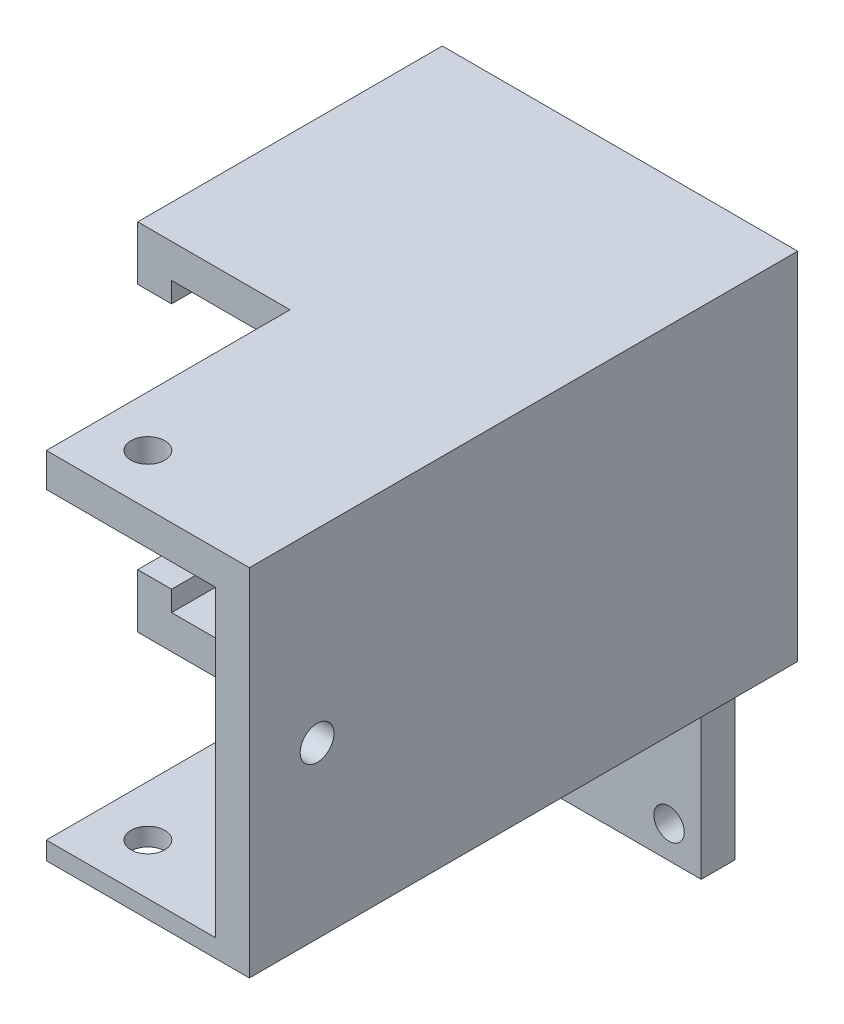
ISO-10303-21;
HEADER;
FILE_DESCRIPTION(('STEP AP214'),'2;1');
FILE_NAME('part.step','',(''),(''),'','','');
FILE_SCHEMA(('AUTOMOTIVE_DESIGN { 1 0 10303 214 1 1 1 1 }'));
ENDSEC;
DATA;
#1=APPLICATION_CONTEXT('core data for automotive mechanical design processes');
#2=APPLICATION_PROTOCOL_DEFINITION('international standard','automotive_design',2000,#1);
#3=PRODUCT_CONTEXT('',#1,'mechanical');
#4=PRODUCT('Part','Part','',(#3));
#5=PRODUCT_RELATED_PRODUCT_CATEGORY('part','',(#4));
#6=PRODUCT_DEFINITION_FORMATION('','',#4);
#7=PRODUCT_DEFINITION_CONTEXT('part definition',#1,'design');
#8=PRODUCT_DEFINITION('design','',#6,#7);
#9=PRODUCT_DEFINITION_SHAPE('','',#8);
#10=(LENGTH_UNIT() NAMED_UNIT(*) SI_UNIT(.MILLI.,.METRE.));
#11=(NAMED_UNIT(*) PLANE_ANGLE_UNIT() SI_UNIT($,.RADIAN.));
#12=(NAMED_UNIT(*) SI_UNIT($,.STERADIAN.) SOLID_ANGLE_UNIT());
#13=UNCERTAINTY_MEASURE_WITH_UNIT(LENGTH_MEASURE(1.E-05),#10,'distance_accuracy_value','');
#14=(GEOMETRIC_REPRESENTATION_CONTEXT(3) GLOBAL_UNCERTAINTY_ASSIGNED_CONTEXT((#13)) GLOBAL_UNIT_ASSIGNED_CONTEXT((#10,
#11,#12)) REPRESENTATION_CONTEXT('',''));
#15=CARTESIAN_POINT('',(0.,0.,0.));
#16=DIRECTION('',(0.,0.,1.));
#17=DIRECTION('',(1.,0.,0.));
#18=AXIS2_PLACEMENT_3D('',#15,#16,#17);
#19=CARTESIAN_POINT('',(0.,0.,45.));
#20=DIRECTION('',(0.,0.,1.));
#21=DIRECTION('',(1.,0.,0.));
#22=AXIS2_PLACEMENT_3D('',#19,#20,#21);
#23=PLANE('',#22);
#24=DIRECTION('',(-1.,0.,0.));
#25=VECTOR('',#24,1.);
#26=CARTESIAN_POINT('',(14.75,38.,45.));
#27=LINE('',#26,#25);
#28=CARTESIAN_POINT('',(-4.24999999999998,38.,45.));
#29=VERTEX_POINT('',#28);
#30=CARTESIAN_POINT('',(-9.24999999999999,38.,45.));
#31=VERTEX_POINT('',#30);
#32=EDGE_CURVE('E231',#29,#31,#27,.T.);
#33=ORIENTED_EDGE('',*,*,#32,.T.);
#34=DIRECTION('',(0.,-1.,0.));
#35=VECTOR('',#34,1.);
#36=CARTESIAN_POINT('',(-9.24999999999999,82.5,45.));
#37=LINE('',#36,#35);
#38=CARTESIAN_POINT('',(-9.24999999999999,30.,45.));
#39=VERTEX_POINT('',#38);
#40=EDGE_CURVE('E314',#31,#39,#37,.T.);
#41=ORIENTED_EDGE('',*,*,#40,.T.);
#42=DIRECTION('',(1.,0.,0.));
#43=VECTOR('',#42,1.);
#44=CARTESIAN_POINT('',(-9.24999999999999,30.,45.));
#45=LINE('',#44,#43);
#46=CARTESIAN_POINT('',(13.25,30.,45.));
#47=VERTEX_POINT('',#46);
#48=EDGE_CURVE('E318',#39,#47,#45,.T.);
#49=ORIENTED_EDGE('',*,*,#48,.T.);
#50=DIRECTION('',(0.,-1.,0.));
#51=VECTOR('',#50,1.);
#52=CARTESIAN_POINT('',(13.25,30.,45.));
#53=LINE('',#52,#51);
#54=CARTESIAN_POINT('',(13.25,35.,45.));
#55=VERTEX_POINT('',#54);
#56=EDGE_CURVE('E258',#55,#47,#53,.T.);
#57=ORIENTED_EDGE('',*,*,#56,.F.);
#58=DIRECTION('',(1.,0.,0.));
#59=VECTOR('',#58,1.);
#60=CARTESIAN_POINT('',(-4.24999999999998,35.,45.));
#61=LINE('',#60,#59);
#62=CARTESIAN_POINT('',(-4.24999999999998,35.,45.));
#63=VERTEX_POINT('',#62);
#64=EDGE_CURVE('E287',#63,#55,#61,.T.);
#65=ORIENTED_EDGE('',*,*,#64,.F.);
#66=DIRECTION('',(0.,-1.,0.));
#67=VECTOR('',#66,1.);
#68=CARTESIAN_POINT('',(-4.24999999999999,77.5,45.));
#69=LINE('',#68,#67);
#70=EDGE_CURVE('E288',#29,#63,#69,.T.);
#71=ORIENTED_EDGE('',*,*,#70,.F.);
#72=EDGE_LOOP('',(#33,#41,#49,#57,#65,#71));
#73=FACE_BOUND('',#72,.T.);
#74=ADVANCED_FACE('F39',(#73),#23,.T.);
#75=CARTESIAN_POINT('',(-4.24999999999999,77.5,45.));
#76=DIRECTION('',(1.,0.,0.));
#77=DIRECTION('',(0.,1.,0.));
#78=AXIS2_PLACEMENT_3D('',#75,#76,#77);
#79=PLANE('',#78);
#80=DIRECTION('',(0.,0.,-1.));
#81=VECTOR('',#80,1.);
#82=CARTESIAN_POINT('',(-4.24999999999998,38.,45.));
#83=LINE('',#82,#81);
#84=CARTESIAN_POINT('',(-4.24999999999999,38.,5.));
#85=VERTEX_POINT('',#84);
#86=EDGE_CURVE('E240',#29,#85,#83,.T.);
#87=ORIENTED_EDGE('',*,*,#86,.F.);
#88=ORIENTED_EDGE('',*,*,#70,.T.);
#89=DIRECTION('',(0.,0.,-1.));
#90=VECTOR('',#89,1.);
#91=CARTESIAN_POINT('',(-4.24999999999998,35.,45.));
#92=LINE('',#91,#90);
#93=CARTESIAN_POINT('',(-4.24999999999998,35.,5.));
#94=VERTEX_POINT('',#93);
#95=EDGE_CURVE('E311',#63,#94,#92,.T.);
#96=ORIENTED_EDGE('',*,*,#95,.T.);
#97=DIRECTION('',(0.,-1.,0.));
#98=VECTOR('',#97,1.);
#99=CARTESIAN_POINT('',(-4.24999999999999,77.5,5.));
#100=LINE('',#99,#98);
#101=EDGE_CURVE('E283',#85,#94,#100,.T.);
#102=ORIENTED_EDGE('',*,*,#101,.F.);
#103=EDGE_LOOP('',(#87,#88,#96,#102));
#104=FACE_BOUND('',#103,.T.);
#105=ADVANCED_FACE('F415',(#104),#79,.T.);
#106=CARTESIAN_POINT('',(0.,0.,5.));
#107=DIRECTION('',(0.,0.,1.));
#108=DIRECTION('',(1.,0.,0.));
#109=AXIS2_PLACEMENT_3D('',#106,#107,#108);
#110=PLANE('',#109);
#111=DIRECTION('',(1.,0.,0.));
#112=VECTOR('',#111,1.);
#113=CARTESIAN_POINT('',(-9.24999999999999,30.,5.));
#114=LINE('',#113,#112);
#115=CARTESIAN_POINT('',(0.,30.,5.));
#116=VERTEX_POINT('',#115);
#117=CARTESIAN_POINT('',(34.,30.,5.));
#118=VERTEX_POINT('',#117);
#119=EDGE_CURVE('E11',#116,#118,#114,.T.);
#120=ORIENTED_EDGE('',*,*,#119,.F.);
#121=DIRECTION('',(0.,-1.,0.));
#122=VECTOR('',#121,1.);
#123=CARTESIAN_POINT('',(0.,0.,5.));
#124=LINE('',#123,#122);
#125=CARTESIAN_POINT('',(0.,0.,5.));
#126=VERTEX_POINT('',#125);
#127=EDGE_CURVE('E347',#116,#126,#124,.T.);
#128=ORIENTED_EDGE('',*,*,#127,.T.);
#129=DIRECTION('',(1.,0.,0.));
#130=VECTOR('',#129,1.);
#131=CARTESIAN_POINT('',(0.,0.,5.));
#132=LINE('',#131,#130);
#133=CARTESIAN_POINT('',(34.,0.,5.));
#134=VERTEX_POINT('',#133);
#135=EDGE_CURVE('E350',#126,#134,#132,.T.);
#136=ORIENTED_EDGE('',*,*,#135,.T.);
#137=DIRECTION('',(0.,1.,0.));
#138=VECTOR('',#137,1.);
#139=CARTESIAN_POINT('',(34.,0.,5.));
#140=LINE('',#139,#138);
#141=EDGE_CURVE('E353',#134,#118,#140,.T.);
#142=ORIENTED_EDGE('',*,*,#141,.T.);
#143=EDGE_LOOP('',(#120,#128,#136,#142));
#144=FACE_BOUND('',#143,.T.);
#145=CARTESIAN_POINT('',(29.25,4.75,5.));
#146=DIRECTION('',(0.,0.,1.));
#147=DIRECTION('',(1.,0.,0.));
#148=AXIS2_PLACEMENT_3D('',#145,#146,#147);
#149=CIRCLE('',#148,2.25);
#150=CARTESIAN_POINT('',(31.5,4.75,5.));
#151=VERTEX_POINT('',#150);
#152=EDGE_CURVE('E329',#151,#151,#149,.T.);
#153=ORIENTED_EDGE('',*,*,#152,.F.);
#154=EDGE_LOOP('',(#153));
#155=FACE_BOUND('',#154,.T.);
#156=CARTESIAN_POINT('',(4.75,25.25,5.));
#157=DIRECTION('',(0.,0.,1.));
#158=DIRECTION('',(1.,0.,0.));
#159=AXIS2_PLACEMENT_3D('',#156,#157,#158);
#160=CIRCLE('',#159,2.25);
#161=CARTESIAN_POINT('',(7.,25.25,5.));
#162=VERTEX_POINT('',#161);
#163=EDGE_CURVE('E341',#162,#162,#160,.T.);
#164=ORIENTED_EDGE('',*,*,#163,.F.);
#165=EDGE_LOOP('',(#164));
#166=FACE_BOUND('',#165,.T.);
#167=CARTESIAN_POINT('',(29.25,25.25,5.));
#168=DIRECTION('',(0.,0.,1.));
#169=DIRECTION('',(1.,0.,0.));
#170=AXIS2_PLACEMENT_3D('',#167,#168,#169);
#171=CIRCLE('',#170,2.25000000000001);
#172=CARTESIAN_POINT('',(31.5,25.25,5.));
#173=VERTEX_POINT('',#172);
#174=EDGE_CURVE('E335',#173,#173,#171,.T.);
#175=ORIENTED_EDGE('',*,*,#174,.F.);
#176=EDGE_LOOP('',(#175));
#177=FACE_BOUND('',#176,.T.);
#178=CARTESIAN_POINT('',(4.75,4.75,5.));
#179=DIRECTION('',(0.,0.,1.));
#180=DIRECTION('',(1.,0.,0.));
#181=AXIS2_PLACEMENT_3D('',#178,#179,#180);
#182=CIRCLE('',#181,2.25);
#183=CARTESIAN_POINT('',(7.,4.75,5.));
#184=VERTEX_POINT('',#183);
#185=EDGE_CURVE('E323',#184,#184,#182,.T.);
#186=ORIENTED_EDGE('',*,*,#185,.F.);
#187=EDGE_LOOP('',(#186));
#188=FACE_BOUND('',#187,.T.);
#189=ADVANCED_FACE('F422',(#144,#155,#166,#177,#188),#110,.T.);
#190=CARTESIAN_POINT('',(0.,0.,0.));
#191=DIRECTION('',(0.,0.,1.));
#192=DIRECTION('',(1.,0.,0.));
#193=AXIS2_PLACEMENT_3D('',#190,#191,#192);
#194=PLANE('',#193);
#195=DIRECTION('',(0.,-1.,0.));
#196=VECTOR('',#195,1.);
#197=CARTESIAN_POINT('',(0.,0.,0.));
#198=LINE('',#197,#196);
#199=CARTESIAN_POINT('',(0.,30.,0.));
#200=VERTEX_POINT('',#199);
#201=CARTESIAN_POINT('',(0.,0.,0.));
#202=VERTEX_POINT('',#201);
#203=EDGE_CURVE('E344',#200,#202,#198,.T.);
#204=ORIENTED_EDGE('',*,*,#203,.F.);
#205=DIRECTION('',(1.,0.,0.));
#206=VECTOR('',#205,1.);
#207=CARTESIAN_POINT('',(0.,30.,0.));
#208=LINE('',#207,#206);
#209=CARTESIAN_POINT('',(-9.24999999999999,30.,0.));
#210=VERTEX_POINT('',#209);
#211=EDGE_CURVE('E351',#210,#200,#208,.T.);
#212=ORIENTED_EDGE('',*,*,#211,.F.);
#213=DIRECTION('',(0.,-1.,0.));
#214=VECTOR('',#213,1.);
#215=CARTESIAN_POINT('',(-9.24999999999999,30.,0.));
#216=LINE('',#215,#214);
#217=CARTESIAN_POINT('',(-9.24999999999999,82.5,0.));
#218=VERTEX_POINT('',#217);
#219=EDGE_CURVE('E368',#218,#210,#216,.T.);
#220=ORIENTED_EDGE('',*,*,#219,.F.);
#221=DIRECTION('',(-1.,0.,0.));
#222=VECTOR('',#221,1.);
#223=CARTESIAN_POINT('',(-9.24999999999999,82.5,0.));
#224=LINE('',#223,#222);
#225=CARTESIAN_POINT('',(43.25,82.5,0.));
#226=VERTEX_POINT('',#225);
#227=EDGE_CURVE('E366',#226,#218,#224,.T.);
#228=ORIENTED_EDGE('',*,*,#227,.F.);
#229=DIRECTION('',(0.,1.,0.));
#230=VECTOR('',#229,1.);
#231=CARTESIAN_POINT('',(43.25,82.5,0.));
#232=LINE('',#231,#230);
#233=CARTESIAN_POINT('',(43.25,30.,0.));
#234=VERTEX_POINT('',#233);
#235=EDGE_CURVE('E364',#234,#226,#232,.T.);
#236=ORIENTED_EDGE('',*,*,#235,.F.);
#237=DIRECTION('',(1.,0.,0.));
#238=VECTOR('',#237,1.);
#239=CARTESIAN_POINT('',(34.,30.,0.));
#240=LINE('',#239,#238);
#241=CARTESIAN_POINT('',(34.,30.,0.));
#242=VERTEX_POINT('',#241);
#243=EDGE_CURVE('E362',#242,#234,#240,.T.);
#244=ORIENTED_EDGE('',*,*,#243,.F.);
#245=DIRECTION('',(0.,1.,0.));
#246=VECTOR('',#245,1.);
#247=CARTESIAN_POINT('',(34.,0.,0.));
#248=LINE('',#247,#246);
#249=CARTESIAN_POINT('',(34.,0.,0.));
#250=VERTEX_POINT('',#249);
#251=EDGE_CURVE('E360',#250,#242,#248,.T.);
#252=ORIENTED_EDGE('',*,*,#251,.F.);
#253=DIRECTION('',(1.,0.,0.));
#254=VECTOR('',#253,1.);
#255=CARTESIAN_POINT('',(0.,0.,0.));
#256=LINE('',#255,#254);
#257=EDGE_CURVE('E358',#202,#250,#256,.T.);
#258=ORIENTED_EDGE('',*,*,#257,.F.);
#259=EDGE_LOOP('',(#204,#212,#220,#228,#236,#244,#252,#258));
#260=FACE_BOUND('',#259,.T.);
#261=CARTESIAN_POINT('',(4.75,25.25,0.));
#262=DIRECTION('',(0.,0.,1.));
#263=DIRECTION('',(1.,0.,0.));
#264=AXIS2_PLACEMENT_3D('',#261,#262,#263);
#265=CIRCLE('',#264,2.25);
#266=CARTESIAN_POINT('',(7.,25.25,0.));
#267=VERTEX_POINT('',#266);
#268=EDGE_CURVE('E338',#267,#267,#265,.T.);
#269=ORIENTED_EDGE('',*,*,#268,.T.);
#270=EDGE_LOOP('',(#269));
#271=FACE_BOUND('',#270,.T.);
#272=CARTESIAN_POINT('',(29.25,25.25,0.));
#273=DIRECTION('',(0.,0.,1.));
#274=DIRECTION('',(1.,0.,0.));
#275=AXIS2_PLACEMENT_3D('',#272,#273,#274);
#276=CIRCLE('',#275,2.25000000000001);
#277=CARTESIAN_POINT('',(31.5,25.25,0.));
#278=VERTEX_POINT('',#277);
#279=EDGE_CURVE('E332',#278,#278,#276,.T.);
#280=ORIENTED_EDGE('',*,*,#279,.T.);
#281=EDGE_LOOP('',(#280));
#282=FACE_BOUND('',#281,.T.);
#283=CARTESIAN_POINT('',(29.25,4.75,0.));
#284=DIRECTION('',(0.,0.,1.));
#285=DIRECTION('',(1.,0.,0.));
#286=AXIS2_PLACEMENT_3D('',#283,#284,#285);
#287=CIRCLE('',#286,2.25);
#288=CARTESIAN_POINT('',(31.5,4.75,0.));
#289=VERTEX_POINT('',#288);
#290=EDGE_CURVE('E326',#289,#289,#287,.T.);
#291=ORIENTED_EDGE('',*,*,#290,.T.);
#292=EDGE_LOOP('',(#291));
#293=FACE_BOUND('',#292,.T.);
#294=CARTESIAN_POINT('',(4.75,4.75,0.));
#295=DIRECTION('',(0.,0.,1.));
#296=DIRECTION('',(1.,0.,0.));
#297=AXIS2_PLACEMENT_3D('',#294,#295,#296);
#298=CIRCLE('',#297,2.25);
#299=CARTESIAN_POINT('',(7.,4.75,0.));
#300=VERTEX_POINT('',#299);
#301=EDGE_CURVE('E321',#300,#300,#298,.T.);
#302=ORIENTED_EDGE('',*,*,#301,.T.);
#303=EDGE_LOOP('',(#302));
#304=FACE_BOUND('',#303,.T.);
#305=ADVANCED_FACE('F498',(#260,#271,#282,#293,#304),#194,.F.);
#306=CARTESIAN_POINT('',(0.,0.,5.));
#307=DIRECTION('',(1.,0.,0.));
#308=DIRECTION('',(0.,1.,0.));
#309=AXIS2_PLACEMENT_3D('',#306,#307,#308);
#310=PLANE('',#309);
#311=ORIENTED_EDGE('',*,*,#203,.T.);
#312=DIRECTION('',(0.,0.,-1.));
#313=VECTOR('',#312,1.);
#314=CARTESIAN_POINT('',(0.,0.,5.));
#315=LINE('',#314,#313);
#316=EDGE_CURVE('E48',#126,#202,#315,.T.);
#317=ORIENTED_EDGE('',*,*,#316,.F.);
#318=ORIENTED_EDGE('',*,*,#127,.F.);
#319=DIRECTION('',(0.,0.,-1.));
#320=VECTOR('',#319,1.);
#321=CARTESIAN_POINT('',(0.,30.,5.));
#322=LINE('',#321,#320);
#323=EDGE_CURVE('E355',#116,#200,#322,.T.);
#324=ORIENTED_EDGE('',*,*,#323,.T.);
#325=EDGE_LOOP('',(#311,#317,#318,#324));
#326=FACE_BOUND('',#325,.T.);
#327=ADVANCED_FACE('F41',(#326),#310,.F.);
#328=CARTESIAN_POINT('',(0.,0.,5.));
#329=DIRECTION('',(0.,1.,0.));
#330=DIRECTION('',(0.,0.,1.));
#331=AXIS2_PLACEMENT_3D('',#328,#329,#330);
#332=PLANE('',#331);
#333=ORIENTED_EDGE('',*,*,#257,.T.);
#334=DIRECTION('',(0.,0.,-1.));
#335=VECTOR('',#334,1.);
#336=CARTESIAN_POINT('',(34.,0.,5.));
#337=LINE('',#336,#335);
#338=EDGE_CURVE('E388',#134,#250,#337,.T.);
#339=ORIENTED_EDGE('',*,*,#338,.F.);
#340=ORIENTED_EDGE('',*,*,#135,.F.);
#341=ORIENTED_EDGE('',*,*,#316,.T.);
#342=EDGE_LOOP('',(#333,#339,#340,#341));
#343=FACE_BOUND('',#342,.T.);
#344=ADVANCED_FACE('F558',(#343),#332,.F.);
#345=CARTESIAN_POINT('',(34.,0.,5.));
#346=DIRECTION('',(-1.,0.,0.));
#347=DIRECTION('',(0.,-1.,0.));
#348=AXIS2_PLACEMENT_3D('',#345,#346,#347);
#349=PLANE('',#348);
#350=ORIENTED_EDGE('',*,*,#251,.T.);
#351=DIRECTION('',(0.,0.,-1.));
#352=VECTOR('',#351,1.);
#353=CARTESIAN_POINT('',(34.,30.,5.));
#354=LINE('',#353,#352);
#355=EDGE_CURVE('E385',#118,#242,#354,.T.);
#356=ORIENTED_EDGE('',*,*,#355,.F.);
#357=ORIENTED_EDGE('',*,*,#141,.F.);
#358=ORIENTED_EDGE('',*,*,#338,.T.);
#359=EDGE_LOOP('',(#350,#356,#357,#358));
#360=FACE_BOUND('',#359,.T.);
#361=ADVANCED_FACE('F555',(#360),#349,.F.);
#362=CARTESIAN_POINT('',(43.25,82.5,5.));
#363=DIRECTION('',(-1.,0.,0.));
#364=DIRECTION('',(0.,-1.,0.));
#365=AXIS2_PLACEMENT_3D('',#362,#363,#364);
#366=PLANE('',#365);
#367=CARTESIAN_POINT('',(43.25,55.075,71.));
#368=DIRECTION('',(1.,0.,0.));
#369=DIRECTION('',(0.,1.,0.));
#370=AXIS2_PLACEMENT_3D('',#367,#368,#369);
#371=CIRCLE('',#370,2.50000000000001);
#372=CARTESIAN_POINT('',(43.25,57.575,71.));
#373=VERTEX_POINT('',#372);
#374=EDGE_CURVE('E242',#373,#373,#371,.T.);
#375=ORIENTED_EDGE('',*,*,#374,.F.);
#376=EDGE_LOOP('',(#375));
#377=FACE_BOUND('',#376,.T.);
#378=ORIENTED_EDGE('',*,*,#235,.T.);
#379=DIRECTION('',(0.,0.,-1.));
#380=VECTOR('',#379,1.);
#381=CARTESIAN_POINT('',(43.25,82.5,5.));
#382=LINE('',#381,#380);
#383=CARTESIAN_POINT('',(43.25,82.5,81.));
#384=VERTEX_POINT('',#383);
#385=EDGE_CURVE('E379',#384,#226,#382,.T.);
#386=ORIENTED_EDGE('',*,*,#385,.F.);
#387=DIRECTION('',(0.,1.,0.));
#388=VECTOR('',#387,1.);
#389=CARTESIAN_POINT('',(43.25,82.5,81.));
#390=LINE('',#389,#388);
#391=CARTESIAN_POINT('',(43.25,30.,81.));
#392=VERTEX_POINT('',#391);
#393=EDGE_CURVE('E265',#392,#384,#390,.T.);
#394=ORIENTED_EDGE('',*,*,#393,.F.);
#395=DIRECTION('',(0.,0.,-1.));
#396=VECTOR('',#395,1.);
#397=CARTESIAN_POINT('',(43.25,30.,5.));
#398=LINE('',#397,#396);
#399=EDGE_CURVE('E382',#392,#234,#398,.T.);
#400=ORIENTED_EDGE('',*,*,#399,.T.);
#401=EDGE_LOOP('',(#378,#386,#394,#400));
#402=FACE_BOUND('',#401,.T.);
#403=ADVANCED_FACE('F551',(#377,#402),#366,.F.);
#404=CARTESIAN_POINT('',(-9.24999999999999,82.5,5.));
#405=DIRECTION('',(0.,-1.,0.));
#406=DIRECTION('',(0.,0.,-1.));
#407=AXIS2_PLACEMENT_3D('',#404,#405,#406);
#408=PLANE('',#407);
#409=CARTESIAN_POINT('',(20.75,82.5,73.5));
#410=DIRECTION('',(0.,-1.,0.));
#411=DIRECTION('',(0.,0.,-1.));
#412=AXIS2_PLACEMENT_3D('',#409,#410,#411);
#413=CIRCLE('',#412,2.5);
#414=CARTESIAN_POINT('',(20.75,82.5,71.));
#415=VERTEX_POINT('',#414);
#416=EDGE_CURVE('E246',#415,#415,#413,.T.);
#417=ORIENTED_EDGE('',*,*,#416,.T.);
#418=EDGE_LOOP('',(#417));
#419=FACE_BOUND('',#418,.T.);
#420=ORIENTED_EDGE('',*,*,#227,.T.);
#421=DIRECTION('',(0.,0.,-1.));
#422=VECTOR('',#421,1.);
#423=CARTESIAN_POINT('',(-9.24999999999999,82.5,5.));
#424=LINE('',#423,#422);
#425=CARTESIAN_POINT('',(-9.24999999999999,82.5,45.));
#426=VERTEX_POINT('',#425);
#427=EDGE_CURVE('E376',#426,#218,#424,.T.);
#428=ORIENTED_EDGE('',*,*,#427,.F.);
#429=DIRECTION('',(-1.,0.,0.));
#430=VECTOR('',#429,1.);
#431=CARTESIAN_POINT('',(-9.24999999999999,82.5,45.));
#432=LINE('',#431,#430);
#433=CARTESIAN_POINT('',(13.25,82.5,45.));
#434=VERTEX_POINT('',#433);
#435=EDGE_CURVE('E320',#434,#426,#432,.T.);
#436=ORIENTED_EDGE('',*,*,#435,.F.);
#437=DIRECTION('',(0.,0.,-1.));
#438=VECTOR('',#437,1.);
#439=CARTESIAN_POINT('',(13.25,82.5,81.));
#440=LINE('',#439,#438);
#441=CARTESIAN_POINT('',(13.25,82.5,81.));
#442=VERTEX_POINT('',#441);
#443=EDGE_CURVE('E280',#442,#434,#440,.T.);
#444=ORIENTED_EDGE('',*,*,#443,.F.);
#445=DIRECTION('',(-1.,0.,0.));
#446=VECTOR('',#445,1.);
#447=CARTESIAN_POINT('',(13.25,82.5,81.));
#448=LINE('',#447,#446);
#449=EDGE_CURVE('E254',#384,#442,#448,.T.);
#450=ORIENTED_EDGE('',*,*,#449,.F.);
#451=ORIENTED_EDGE('',*,*,#385,.T.);
#452=EDGE_LOOP('',(#420,#428,#436,#444,#450,#451));
#453=FACE_BOUND('',#452,.T.);
#454=ADVANCED_FACE('F451',(#419,#453),#408,.F.);
#455=CARTESIAN_POINT('',(-9.24999999999999,30.,5.));
#456=DIRECTION('',(1.,0.,0.));
#457=DIRECTION('',(0.,1.,0.));
#458=AXIS2_PLACEMENT_3D('',#455,#456,#457);
#459=PLANE('',#458);
#460=ORIENTED_EDGE('',*,*,#40,.F.);
#461=DIRECTION('',(0.,0.,1.));
#462=VECTOR('',#461,1.);
#463=CARTESIAN_POINT('',(-9.24999999999999,38.,45.));
#464=LINE('',#463,#462);
#465=CARTESIAN_POINT('',(-9.24999999999999,38.,5.));
#466=VERTEX_POINT('',#465);
#467=EDGE_CURVE('E228',#466,#31,#464,.T.);
#468=ORIENTED_EDGE('',*,*,#467,.F.);
#469=DIRECTION('',(0.,-1.,0.));
#470=VECTOR('',#469,1.);
#471=CARTESIAN_POINT('',(-9.24999999999999,74.5,5.));
#472=LINE('',#471,#470);
#473=CARTESIAN_POINT('',(-9.24999999999999,74.5,5.));
#474=VERTEX_POINT('',#473);
#475=EDGE_CURVE('E225',#474,#466,#472,.T.);
#476=ORIENTED_EDGE('',*,*,#475,.F.);
#477=DIRECTION('',(0.,0.,-1.));
#478=VECTOR('',#477,1.);
#479=CARTESIAN_POINT('',(-9.24999999999999,74.5,45.));
#480=LINE('',#479,#478);
#481=CARTESIAN_POINT('',(-9.24999999999999,74.5,45.));
#482=VERTEX_POINT('',#481);
#483=EDGE_CURVE('E223',#482,#474,#480,.T.);
#484=ORIENTED_EDGE('',*,*,#483,.F.);
#485=EDGE_CURVE('E315',#426,#482,#37,.T.);
#486=ORIENTED_EDGE('',*,*,#485,.F.);
#487=ORIENTED_EDGE('',*,*,#427,.T.);
#488=ORIENTED_EDGE('',*,*,#219,.T.);
#489=DIRECTION('',(0.,0.,-1.));
#490=VECTOR('',#489,1.);
#491=CARTESIAN_POINT('',(-9.24999999999999,30.,5.));
#492=LINE('',#491,#490);
#493=EDGE_CURVE('E373',#39,#210,#492,.T.);
#494=ORIENTED_EDGE('',*,*,#493,.F.);
#495=EDGE_LOOP('',(#460,#468,#476,#484,#486,#487,#488,#494));
#496=FACE_BOUND('',#495,.T.);
#497=ADVANCED_FACE('F457',(#496),#459,.F.);
#498=CARTESIAN_POINT('',(0.,30.,5.));
#499=DIRECTION('',(0.,1.,0.));
#500=DIRECTION('',(0.,0.,1.));
#501=AXIS2_PLACEMENT_3D('',#498,#499,#500);
#502=PLANE('',#501);
#503=CARTESIAN_POINT('',(20.75,30.,73.5));
#504=DIRECTION('',(0.,1.,0.));
#505=DIRECTION('',(0.,0.,1.));
#506=AXIS2_PLACEMENT_3D('',#503,#504,#505);
#507=CIRCLE('',#506,2.5);
#508=CARTESIAN_POINT('',(20.75,30.,76.));
#509=VERTEX_POINT('',#508);
#510=EDGE_CURVE('E250',#509,#509,#507,.T.);
#511=ORIENTED_EDGE('',*,*,#510,.T.);
#512=EDGE_LOOP('',(#511));
#513=FACE_BOUND('',#512,.T.);
#514=ORIENTED_EDGE('',*,*,#211,.T.);
#515=ORIENTED_EDGE('',*,*,#323,.F.);
#516=ORIENTED_EDGE('',*,*,#119,.T.);
#517=ORIENTED_EDGE('',*,*,#355,.T.);
#518=ORIENTED_EDGE('',*,*,#243,.T.);
#519=ORIENTED_EDGE('',*,*,#399,.F.);
#520=DIRECTION('',(1.,0.,0.));
#521=VECTOR('',#520,1.);
#522=CARTESIAN_POINT('',(43.25,30.,81.));
#523=LINE('',#522,#521);
#524=CARTESIAN_POINT('',(13.25,30.,81.));
#525=VERTEX_POINT('',#524);
#526=EDGE_CURVE('E262',#525,#392,#523,.T.);
#527=ORIENTED_EDGE('',*,*,#526,.F.);
#528=DIRECTION('',(0.,0.,-1.));
#529=VECTOR('',#528,1.);
#530=CARTESIAN_POINT('',(13.25,30.,81.));
#531=LINE('',#530,#529);
#532=EDGE_CURVE('E268',#525,#47,#531,.T.);
#533=ORIENTED_EDGE('',*,*,#532,.T.);
#534=ORIENTED_EDGE('',*,*,#48,.F.);
#535=ORIENTED_EDGE('',*,*,#493,.T.);
#536=EDGE_LOOP('',(#514,#515,#516,#517,#518,#519,#527,#533,#534,#535));
#537=FACE_BOUND('',#536,.T.);
#538=ADVANCED_FACE('F533',(#513,#537),#502,.F.);
#539=CARTESIAN_POINT('',(4.75,25.25,5.));
#540=DIRECTION('',(0.,0.,-1.));
#541=DIRECTION('',(-1.,0.,0.));
#542=AXIS2_PLACEMENT_3D('',#539,#540,#541);
#543=CYLINDRICAL_SURFACE('',#542,2.25);
#544=ORIENTED_EDGE('',*,*,#163,.T.);
#545=EDGE_LOOP('',(#544));
#546=FACE_BOUND('',#545,.T.);
#547=ORIENTED_EDGE('',*,*,#268,.F.);
#548=EDGE_LOOP('',(#547));
#549=FACE_BOUND('',#548,.T.);
#550=ADVANCED_FACE('F520',(#546,#549),#543,.F.);
#551=CARTESIAN_POINT('',(29.25,25.25,5.));
#552=DIRECTION('',(0.,0.,-1.));
#553=DIRECTION('',(-1.,0.,0.));
#554=AXIS2_PLACEMENT_3D('',#551,#552,#553);
#555=CYLINDRICAL_SURFACE('',#554,2.25000000000001);
#556=ORIENTED_EDGE('',*,*,#174,.T.);
#557=EDGE_LOOP('',(#556));
#558=FACE_BOUND('',#557,.T.);
#559=ORIENTED_EDGE('',*,*,#279,.F.);
#560=EDGE_LOOP('',(#559));
#561=FACE_BOUND('',#560,.T.);
#562=ADVANCED_FACE('F517',(#558,#561),#555,.F.);
#563=CARTESIAN_POINT('',(29.25,4.75,5.));
#564=DIRECTION('',(0.,0.,-1.));
#565=DIRECTION('',(-1.,0.,0.));
#566=AXIS2_PLACEMENT_3D('',#563,#564,#565);
#567=CYLINDRICAL_SURFACE('',#566,2.25);
#568=ORIENTED_EDGE('',*,*,#152,.T.);
#569=EDGE_LOOP('',(#568));
#570=FACE_BOUND('',#569,.T.);
#571=ORIENTED_EDGE('',*,*,#290,.F.);
#572=EDGE_LOOP('',(#571));
#573=FACE_BOUND('',#572,.T.);
#574=ADVANCED_FACE('F434',(#570,#573),#567,.F.);
#575=CARTESIAN_POINT('',(4.75,4.75,5.));
#576=DIRECTION('',(0.,0.,-1.));
#577=DIRECTION('',(-1.,0.,0.));
#578=AXIS2_PLACEMENT_3D('',#575,#576,#577);
#579=CYLINDRICAL_SURFACE('',#578,2.25);
#580=ORIENTED_EDGE('',*,*,#185,.T.);
#581=EDGE_LOOP('',(#580));
#582=FACE_BOUND('',#581,.T.);
#583=ORIENTED_EDGE('',*,*,#301,.F.);
#584=EDGE_LOOP('',(#583));
#585=FACE_BOUND('',#584,.T.);
#586=ADVANCED_FACE('F427',(#582,#585),#579,.F.);
#587=DIRECTION('',(-1.,0.,0.));
#588=VECTOR('',#587,1.);
#589=CARTESIAN_POINT('',(14.75,74.5,45.));
#590=LINE('',#589,#588);
#591=CARTESIAN_POINT('',(-4.24999999999999,74.5,45.));
#592=VERTEX_POINT('',#591);
#593=EDGE_CURVE('E230',#592,#482,#590,.T.);
#594=ORIENTED_EDGE('',*,*,#593,.F.);
#595=CARTESIAN_POINT('',(-4.24999999999999,77.5,45.));
#596=VERTEX_POINT('',#595);
#597=EDGE_CURVE('E284',#596,#592,#69,.T.);
#598=ORIENTED_EDGE('',*,*,#597,.F.);
#599=DIRECTION('',(-1.,0.,0.));
#600=VECTOR('',#599,1.);
#601=CARTESIAN_POINT('',(-4.24999999999999,77.5,45.));
#602=LINE('',#601,#600);
#603=CARTESIAN_POINT('',(13.25,77.5,45.));
#604=VERTEX_POINT('',#603);
#605=EDGE_CURVE('E291',#604,#596,#602,.T.);
#606=ORIENTED_EDGE('',*,*,#605,.F.);
#607=DIRECTION('',(0.,-1.,0.));
#608=VECTOR('',#607,1.);
#609=CARTESIAN_POINT('',(13.25,82.5,45.));
#610=LINE('',#609,#608);
#611=EDGE_CURVE('E253',#434,#604,#610,.T.);
#612=ORIENTED_EDGE('',*,*,#611,.F.);
#613=ORIENTED_EDGE('',*,*,#435,.T.);
#614=ORIENTED_EDGE('',*,*,#485,.T.);
#615=EDGE_LOOP('',(#594,#598,#606,#612,#613,#614));
#616=FACE_BOUND('',#615,.T.);
#617=ADVANCED_FACE('F418',(#616),#23,.T.);
#618=DIRECTION('',(0.,0.,1.));
#619=VECTOR('',#618,1.);
#620=CARTESIAN_POINT('',(-4.24999999999999,74.5,45.));
#621=LINE('',#620,#619);
#622=CARTESIAN_POINT('',(-4.24999999999999,74.5,5.));
#623=VERTEX_POINT('',#622);
#624=EDGE_CURVE('E234',#623,#592,#621,.T.);
#625=ORIENTED_EDGE('',*,*,#624,.F.);
#626=CARTESIAN_POINT('',(-4.24999999999999,77.5,5.));
#627=VERTEX_POINT('',#626);
#628=EDGE_CURVE('E294',#627,#623,#100,.T.);
#629=ORIENTED_EDGE('',*,*,#628,.F.);
#630=DIRECTION('',(0.,0.,-1.));
#631=VECTOR('',#630,1.);
#632=CARTESIAN_POINT('',(-4.24999999999999,77.5,45.));
#633=LINE('',#632,#631);
#634=EDGE_CURVE('E293',#596,#627,#633,.T.);
#635=ORIENTED_EDGE('',*,*,#634,.F.);
#636=ORIENTED_EDGE('',*,*,#597,.T.);
#637=EDGE_LOOP('',(#625,#629,#635,#636));
#638=FACE_BOUND('',#637,.T.);
#639=ADVANCED_FACE('F411',(#638),#79,.T.);
#640=CARTESIAN_POINT('',(-4.24999999999998,35.,45.));
#641=DIRECTION('',(0.,1.,0.));
#642=DIRECTION('',(0.,0.,1.));
#643=AXIS2_PLACEMENT_3D('',#640,#641,#642);
#644=PLANE('',#643);
#645=DIRECTION('',(-1.,0.,0.));
#646=VECTOR('',#645,1.);
#647=CARTESIAN_POINT('',(13.25,35.,55.480590064434));
#648=LINE('',#647,#646);
#649=CARTESIAN_POINT('',(38.25,35.,55.480590064434));
#650=VERTEX_POINT('',#649);
#651=CARTESIAN_POINT('',(13.25,35.,55.480590064434));
#652=VERTEX_POINT('',#651);
#653=EDGE_CURVE('E214',#650,#652,#648,.T.);
#654=ORIENTED_EDGE('',*,*,#653,.F.);
#655=DIRECTION('',(0.,0.,-1.));
#656=VECTOR('',#655,1.);
#657=CARTESIAN_POINT('',(38.25,35.,45.));
#658=LINE('',#657,#656);
#659=CARTESIAN_POINT('',(38.25,35.,5.));
#660=VERTEX_POINT('',#659);
#661=EDGE_CURVE('E309',#650,#660,#658,.T.);
#662=ORIENTED_EDGE('',*,*,#661,.T.);
#663=DIRECTION('',(1.,0.,0.));
#664=VECTOR('',#663,1.);
#665=CARTESIAN_POINT('',(-4.24999999999998,35.,5.));
#666=LINE('',#665,#664);
#667=EDGE_CURVE('E297',#94,#660,#666,.T.);
#668=ORIENTED_EDGE('',*,*,#667,.F.);
#669=ORIENTED_EDGE('',*,*,#95,.F.);
#670=ORIENTED_EDGE('',*,*,#64,.T.);
#671=DIRECTION('',(0.,0.,-1.));
#672=VECTOR('',#671,1.);
#673=CARTESIAN_POINT('',(13.25,35.,81.));
#674=LINE('',#673,#672);
#675=EDGE_CURVE('E275',#652,#55,#674,.T.);
#676=ORIENTED_EDGE('',*,*,#675,.F.);
#677=EDGE_LOOP('',(#654,#662,#668,#669,#670,#676));
#678=FACE_BOUND('',#677,.T.);
#679=ADVANCED_FACE('F402',(#678),#644,.T.);
#680=CARTESIAN_POINT('',(38.25,77.5,45.));
#681=DIRECTION('',(-1.,0.,0.));
#682=DIRECTION('',(0.,-1.,0.));
#683=AXIS2_PLACEMENT_3D('',#680,#681,#682);
#684=PLANE('',#683);
#685=CARTESIAN_POINT('',(38.25,55.075,71.));
#686=DIRECTION('',(-1.,0.,0.));
#687=DIRECTION('',(0.,-1.,0.));
#688=AXIS2_PLACEMENT_3D('',#685,#686,#687);
#689=CIRCLE('',#688,2.50000000000001);
#690=CARTESIAN_POINT('',(38.25,52.575,71.));
#691=VERTEX_POINT('',#690);
#692=EDGE_CURVE('E245',#691,#691,#689,.T.);
#693=ORIENTED_EDGE('',*,*,#692,.F.);
#694=EDGE_LOOP('',(#693));
#695=FACE_BOUND('',#694,.T.);
#696=DIRECTION('',(0.,1.,0.));
#697=VECTOR('',#696,1.);
#698=CARTESIAN_POINT('',(38.25,77.5,5.));
#699=LINE('',#698,#697);
#700=CARTESIAN_POINT('',(38.25,77.5,5.));
#701=VERTEX_POINT('',#700);
#702=EDGE_CURVE('E300',#660,#701,#699,.T.);
#703=ORIENTED_EDGE('',*,*,#702,.F.);
#704=ORIENTED_EDGE('',*,*,#661,.F.);
#705=DIRECTION('',(0.,1.,0.));
#706=VECTOR('',#705,1.);
#707=CARTESIAN_POINT('',(38.25,32.65,55.480590064434));
#708=LINE('',#707,#706);
#709=CARTESIAN_POINT('',(38.25,32.65,55.480590064434));
#710=VERTEX_POINT('',#709);
#711=EDGE_CURVE('E207',#710,#650,#708,.T.);
#712=ORIENTED_EDGE('',*,*,#711,.F.);
#713=DIRECTION('',(0.,0.,-1.));
#714=VECTOR('',#713,1.);
#715=CARTESIAN_POINT('',(38.25,32.65,81.));
#716=LINE('',#715,#714);
#717=CARTESIAN_POINT('',(38.25,32.65,81.));
#718=VERTEX_POINT('',#717);
#719=EDGE_CURVE('E203',#718,#710,#716,.T.);
#720=ORIENTED_EDGE('',*,*,#719,.F.);
#721=DIRECTION('',(0.,-1.,0.));
#722=VECTOR('',#721,1.);
#723=CARTESIAN_POINT('',(38.25,77.5,81.));
#724=LINE('',#723,#722);
#725=CARTESIAN_POINT('',(38.25,77.5,81.));
#726=VERTEX_POINT('',#725);
#727=EDGE_CURVE('E192',#726,#718,#724,.T.);
#728=ORIENTED_EDGE('',*,*,#727,.F.);
#729=DIRECTION('',(0.,0.,-1.));
#730=VECTOR('',#729,1.);
#731=CARTESIAN_POINT('',(38.25,77.5,45.));
#732=LINE('',#731,#730);
#733=EDGE_CURVE('E307',#726,#701,#732,.T.);
#734=ORIENTED_EDGE('',*,*,#733,.T.);
#735=EDGE_LOOP('',(#703,#704,#712,#720,#728,#734));
#736=FACE_BOUND('',#735,.T.);
#737=ADVANCED_FACE('F205',(#695,#736),#684,.T.);
#738=CARTESIAN_POINT('',(-4.24999999999999,77.5,45.));
#739=DIRECTION('',(0.,-1.,0.));
#740=DIRECTION('',(0.,0.,-1.));
#741=AXIS2_PLACEMENT_3D('',#738,#739,#740);
#742=PLANE('',#741);
#743=CARTESIAN_POINT('',(20.75,77.5,73.5));
#744=DIRECTION('',(0.,-1.,0.));
#745=DIRECTION('',(0.,0.,-1.));
#746=AXIS2_PLACEMENT_3D('',#743,#744,#745);
#747=CIRCLE('',#746,2.5);
#748=CARTESIAN_POINT('',(20.75,77.5,71.));
#749=VERTEX_POINT('',#748);
#750=EDGE_CURVE('E249',#749,#749,#747,.T.);
#751=ORIENTED_EDGE('',*,*,#750,.F.);
#752=EDGE_LOOP('',(#751));
#753=FACE_BOUND('',#752,.T.);
#754=DIRECTION('',(-1.,0.,0.));
#755=VECTOR('',#754,1.);
#756=CARTESIAN_POINT('',(-4.24999999999999,77.5,5.));
#757=LINE('',#756,#755);
#758=EDGE_CURVE('E303',#701,#627,#757,.T.);
#759=ORIENTED_EDGE('',*,*,#758,.F.);
#760=ORIENTED_EDGE('',*,*,#733,.F.);
#761=DIRECTION('',(1.,0.,0.));
#762=VECTOR('',#761,1.);
#763=CARTESIAN_POINT('',(13.25,77.5,81.));
#764=LINE('',#763,#762);
#765=CARTESIAN_POINT('',(13.25,77.5,81.));
#766=VERTEX_POINT('',#765);
#767=EDGE_CURVE('E198',#766,#726,#764,.T.);
#768=ORIENTED_EDGE('',*,*,#767,.F.);
#769=DIRECTION('',(0.,0.,-1.));
#770=VECTOR('',#769,1.);
#771=CARTESIAN_POINT('',(13.25,77.5,81.));
#772=LINE('',#771,#770);
#773=EDGE_CURVE('E277',#766,#604,#772,.T.);
#774=ORIENTED_EDGE('',*,*,#773,.T.);
#775=ORIENTED_EDGE('',*,*,#605,.T.);
#776=ORIENTED_EDGE('',*,*,#634,.T.);
#777=EDGE_LOOP('',(#759,#760,#768,#774,#775,#776));
#778=FACE_BOUND('',#777,.T.);
#779=ADVANCED_FACE('F401',(#753,#778),#742,.T.);
#780=ORIENTED_EDGE('',*,*,#628,.T.);
#781=DIRECTION('',(-1.,0.,0.));
#782=VECTOR('',#781,1.);
#783=CARTESIAN_POINT('',(14.75,74.5,5.));
#784=LINE('',#783,#782);
#785=EDGE_CURVE('E64',#623,#474,#784,.T.);
#786=ORIENTED_EDGE('',*,*,#785,.T.);
#787=ORIENTED_EDGE('',*,*,#475,.T.);
#788=DIRECTION('',(-1.,0.,0.));
#789=VECTOR('',#788,1.);
#790=CARTESIAN_POINT('',(14.75,38.,5.));
#791=LINE('',#790,#789);
#792=EDGE_CURVE('E235',#85,#466,#791,.T.);
#793=ORIENTED_EDGE('',*,*,#792,.F.);
#794=ORIENTED_EDGE('',*,*,#101,.T.);
#795=ORIENTED_EDGE('',*,*,#667,.T.);
#796=ORIENTED_EDGE('',*,*,#702,.T.);
#797=ORIENTED_EDGE('',*,*,#758,.T.);
#798=EDGE_LOOP('',(#780,#786,#787,#793,#794,#795,#796,#797));
#799=FACE_BOUND('',#798,.T.);
#800=ADVANCED_FACE('F408',(#799),#110,.T.);
#801=CARTESIAN_POINT('',(13.25,82.5,81.));
#802=DIRECTION('',(1.,0.,0.));
#803=DIRECTION('',(0.,0.,-1.));
#804=AXIS2_PLACEMENT_3D('',#801,#802,#803);
#805=PLANE('',#804);
#806=ORIENTED_EDGE('',*,*,#611,.T.);
#807=ORIENTED_EDGE('',*,*,#773,.F.);
#808=DIRECTION('',(0.,-1.,0.));
#809=VECTOR('',#808,1.);
#810=CARTESIAN_POINT('',(13.25,82.5,81.));
#811=LINE('',#810,#809);
#812=EDGE_CURVE('E257',#442,#766,#811,.T.);
#813=ORIENTED_EDGE('',*,*,#812,.F.);
#814=ORIENTED_EDGE('',*,*,#443,.T.);
#815=EDGE_LOOP('',(#806,#807,#813,#814));
#816=FACE_BOUND('',#815,.T.);
#817=ADVANCED_FACE('F447',(#816),#805,.F.);
#818=CARTESIAN_POINT('',(13.25,30.,81.));
#819=DIRECTION('',(1.,0.,0.));
#820=DIRECTION('',(0.,1.,0.));
#821=AXIS2_PLACEMENT_3D('',#818,#819,#820);
#822=PLANE('',#821);
#823=DIRECTION('',(0.,0.,1.));
#824=VECTOR('',#823,1.);
#825=CARTESIAN_POINT('',(13.25,32.65,81.));
#826=LINE('',#825,#824);
#827=CARTESIAN_POINT('',(13.25,32.65,55.480590064434));
#828=VERTEX_POINT('',#827);
#829=CARTESIAN_POINT('',(13.25,32.65,81.));
#830=VERTEX_POINT('',#829);
#831=EDGE_CURVE('E56',#828,#830,#826,.T.);
#832=ORIENTED_EDGE('',*,*,#831,.F.);
#833=DIRECTION('',(0.,1.,0.));
#834=VECTOR('',#833,1.);
#835=CARTESIAN_POINT('',(13.25,32.65,55.480590064434));
#836=LINE('',#835,#834);
#837=EDGE_CURVE('E219',#828,#652,#836,.T.);
#838=ORIENTED_EDGE('',*,*,#837,.T.);
#839=ORIENTED_EDGE('',*,*,#675,.T.);
#840=ORIENTED_EDGE('',*,*,#56,.T.);
#841=ORIENTED_EDGE('',*,*,#532,.F.);
#842=DIRECTION('',(0.,-1.,0.));
#843=VECTOR('',#842,1.);
#844=CARTESIAN_POINT('',(13.25,30.,81.));
#845=LINE('',#844,#843);
#846=EDGE_CURVE('E200',#830,#525,#845,.T.);
#847=ORIENTED_EDGE('',*,*,#846,.F.);
#848=EDGE_LOOP('',(#832,#838,#839,#840,#841,#847));
#849=FACE_BOUND('',#848,.T.);
#850=ADVANCED_FACE('F483',(#849),#822,.F.);
#851=CARTESIAN_POINT('',(0.,0.,81.));
#852=DIRECTION('',(0.,0.,-1.));
#853=DIRECTION('',(-1.,0.,0.));
#854=AXIS2_PLACEMENT_3D('',#851,#852,#853);
#855=PLANE('',#854);
#856=ORIENTED_EDGE('',*,*,#727,.T.);
#857=DIRECTION('',(1.,0.,0.));
#858=VECTOR('',#857,1.);
#859=CARTESIAN_POINT('',(13.25,32.65,81.));
#860=LINE('',#859,#858);
#861=EDGE_CURVE('E195',#830,#718,#860,.T.);
#862=ORIENTED_EDGE('',*,*,#861,.F.);
#863=ORIENTED_EDGE('',*,*,#846,.T.);
#864=ORIENTED_EDGE('',*,*,#526,.T.);
#865=ORIENTED_EDGE('',*,*,#393,.T.);
#866=ORIENTED_EDGE('',*,*,#449,.T.);
#867=ORIENTED_EDGE('',*,*,#812,.T.);
#868=ORIENTED_EDGE('',*,*,#767,.T.);
#869=EDGE_LOOP('',(#856,#862,#863,#864,#865,#866,#867,#868));
#870=FACE_BOUND('',#869,.T.);
#871=ADVANCED_FACE('F194',(#870),#855,.F.);
#872=CARTESIAN_POINT('',(20.75,82.5,73.5));
#873=DIRECTION('',(0.,-1.,0.));
#874=DIRECTION('',(0.,0.,-1.));
#875=AXIS2_PLACEMENT_3D('',#872,#873,#874);
#876=CYLINDRICAL_SURFACE('',#875,2.5);
#877=ORIENTED_EDGE('',*,*,#750,.T.);
#878=EDGE_LOOP('',(#877));
#879=FACE_BOUND('',#878,.T.);
#880=ORIENTED_EDGE('',*,*,#416,.F.);
#881=EDGE_LOOP('',(#880));
#882=FACE_BOUND('',#881,.T.);
#883=ADVANCED_FACE('F477',(#879,#882),#876,.F.);
#884=CARTESIAN_POINT('',(20.75,32.65,73.5));
#885=DIRECTION('',(0.,-1.,0.));
#886=DIRECTION('',(0.,0.,-1.));
#887=AXIS2_PLACEMENT_3D('',#884,#885,#886);
#888=CIRCLE('',#887,2.5);
#889=CARTESIAN_POINT('',(20.75,32.65,71.));
#890=VERTEX_POINT('',#889);
#891=EDGE_CURVE('E43',#890,#890,#888,.F.);
#892=ORIENTED_EDGE('',*,*,#891,.T.);
#893=EDGE_LOOP('',(#892));
#894=FACE_BOUND('',#893,.T.);
#895=ORIENTED_EDGE('',*,*,#510,.F.);
#896=EDGE_LOOP('',(#895));
#897=FACE_BOUND('',#896,.T.);
#898=ADVANCED_FACE('F476',(#894,#897),#876,.F.);
#899=CARTESIAN_POINT('',(-9.24999999999999,55.075,71.));
#900=DIRECTION('',(1.,0.,0.));
#901=DIRECTION('',(0.,1.,0.));
#902=AXIS2_PLACEMENT_3D('',#899,#900,#901);
#903=CYLINDRICAL_SURFACE('',#902,2.50000000000001);
#904=ORIENTED_EDGE('',*,*,#692,.T.);
#905=EDGE_LOOP('',(#904));
#906=FACE_BOUND('',#905,.T.);
#907=ORIENTED_EDGE('',*,*,#374,.T.);
#908=EDGE_LOOP('',(#907));
#909=FACE_BOUND('',#908,.T.);
#910=ADVANCED_FACE('F397',(#906,#909),#903,.F.);
#911=CARTESIAN_POINT('',(14.75,38.,45.));
#912=DIRECTION('',(0.,-1.,0.));
#913=DIRECTION('',(0.,0.,-1.));
#914=AXIS2_PLACEMENT_3D('',#911,#912,#913);
#915=PLANE('',#914);
#916=ORIENTED_EDGE('',*,*,#86,.T.);
#917=ORIENTED_EDGE('',*,*,#792,.T.);
#918=ORIENTED_EDGE('',*,*,#467,.T.);
#919=ORIENTED_EDGE('',*,*,#32,.F.);
#920=EDGE_LOOP('',(#916,#917,#918,#919));
#921=FACE_BOUND('',#920,.T.);
#922=ADVANCED_FACE('F462',(#921),#915,.F.);
#923=CARTESIAN_POINT('',(14.75,74.5,45.));
#924=DIRECTION('',(0.,1.,0.));
#925=DIRECTION('',(-1.,0.,0.));
#926=AXIS2_PLACEMENT_3D('',#923,#924,#925);
#927=PLANE('',#926);
#928=ORIENTED_EDGE('',*,*,#624,.T.);
#929=ORIENTED_EDGE('',*,*,#593,.T.);
#930=ORIENTED_EDGE('',*,*,#483,.T.);
#931=ORIENTED_EDGE('',*,*,#785,.F.);
#932=EDGE_LOOP('',(#928,#929,#930,#931));
#933=FACE_BOUND('',#932,.T.);
#934=ADVANCED_FACE('F460',(#933),#927,.F.);
#935=CARTESIAN_POINT('',(0.,32.65,0.));
#936=DIRECTION('',(0.,-1.,0.));
#937=DIRECTION('',(0.,0.,-1.));
#938=AXIS2_PLACEMENT_3D('',#935,#936,#937);
#939=PLANE('',#938);
#940=ORIENTED_EDGE('',*,*,#831,.T.);
#941=ORIENTED_EDGE('',*,*,#861,.T.);
#942=ORIENTED_EDGE('',*,*,#719,.T.);
#943=DIRECTION('',(-1.,0.,0.));
#944=VECTOR('',#943,1.);
#945=CARTESIAN_POINT('',(13.25,32.65,55.480590064434));
#946=LINE('',#945,#944);
#947=EDGE_CURVE('E209',#710,#828,#946,.T.);
#948=ORIENTED_EDGE('',*,*,#947,.T.);
#949=EDGE_LOOP('',(#940,#941,#942,#948));
#950=FACE_BOUND('',#949,.T.);
#951=ORIENTED_EDGE('',*,*,#891,.F.);
#952=EDGE_LOOP('',(#951));
#953=FACE_BOUND('',#952,.T.);
#954=ADVANCED_FACE('F211',(#950,#953),#939,.F.);
#955=CARTESIAN_POINT('',(13.25,32.65,55.480590064434));
#956=DIRECTION('',(0.,0.,-1.));
#957=DIRECTION('',(-1.,0.,0.));
#958=AXIS2_PLACEMENT_3D('',#955,#956,#957);
#959=PLANE('',#958);
#960=ORIENTED_EDGE('',*,*,#653,.T.);
#961=ORIENTED_EDGE('',*,*,#837,.F.);
#962=ORIENTED_EDGE('',*,*,#947,.F.);
#963=ORIENTED_EDGE('',*,*,#711,.T.);
#964=EDGE_LOOP('',(#960,#961,#962,#963));
#965=FACE_BOUND('',#964,.T.);
#966=ADVANCED_FACE('F468',(#965),#959,.F.);
#967=CLOSED_SHELL('',(#74,#105,#189,#305,#327,#344,#361,#403,#454,#497,#538,#550,#562,#574,#586,
#617,#639,#679,#737,#779,#800,#817,#850,#871,#883,#898,#910,#922,#934,#954,#966));
#968=MANIFOLD_SOLID_BREP('B2',#967);
#969=ADVANCED_BREP_SHAPE_REPRESENTATION('',(#18,#968),#14);
#970=SHAPE_DEFINITION_REPRESENTATION(#9,#969);
ENDSEC;
END-ISO-10303-21;
